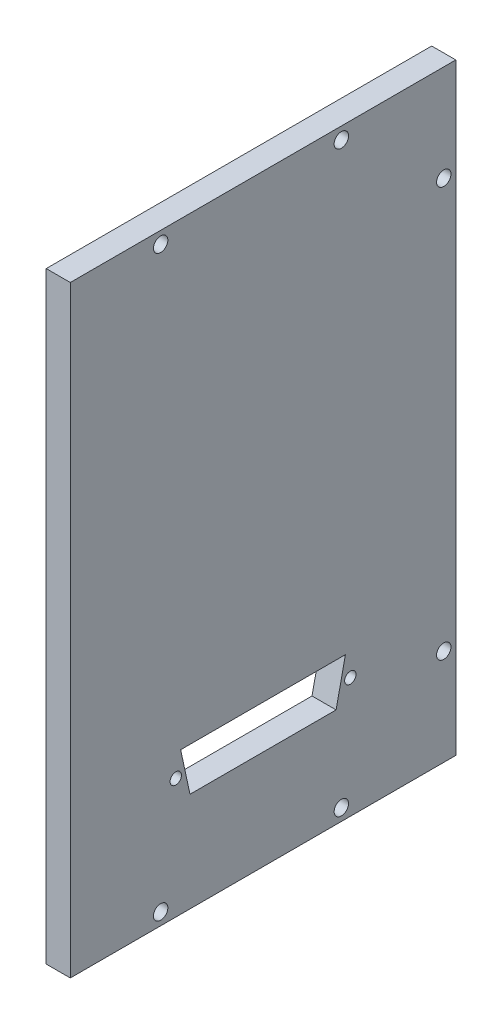
ISO-10303-21;
HEADER;
FILE_DESCRIPTION(('STEP AP214'),'2;1');
FILE_NAME('part.step','',(''),(''),'','','');
FILE_SCHEMA(('AUTOMOTIVE_DESIGN { 1 0 10303 214 1 1 1 1 }'));
ENDSEC;
DATA;
#1=APPLICATION_CONTEXT('core data for automotive mechanical design processes');
#2=APPLICATION_PROTOCOL_DEFINITION('international standard','automotive_design',2000,#1);
#3=PRODUCT_CONTEXT('',#1,'mechanical');
#4=PRODUCT('Part','Part','',(#3));
#5=PRODUCT_RELATED_PRODUCT_CATEGORY('part','',(#4));
#6=PRODUCT_DEFINITION_FORMATION('','',#4);
#7=PRODUCT_DEFINITION_CONTEXT('part definition',#1,'design');
#8=PRODUCT_DEFINITION('design','',#6,#7);
#9=PRODUCT_DEFINITION_SHAPE('','',#8);
#10=(LENGTH_UNIT() NAMED_UNIT(*) SI_UNIT(.MILLI.,.METRE.));
#11=(NAMED_UNIT(*) PLANE_ANGLE_UNIT() SI_UNIT($,.RADIAN.));
#12=(NAMED_UNIT(*) SI_UNIT($,.STERADIAN.) SOLID_ANGLE_UNIT());
#13=UNCERTAINTY_MEASURE_WITH_UNIT(LENGTH_MEASURE(1.E-05),#10,'distance_accuracy_value','');
#14=(GEOMETRIC_REPRESENTATION_CONTEXT(3) GLOBAL_UNCERTAINTY_ASSIGNED_CONTEXT((#13)) GLOBAL_UNIT_ASSIGNED_CONTEXT((#10,
#11,#12)) REPRESENTATION_CONTEXT('',''));
#15=CARTESIAN_POINT('',(0.,0.,0.));
#16=DIRECTION('',(0.,0.,1.));
#17=DIRECTION('',(1.,0.,0.));
#18=AXIS2_PLACEMENT_3D('',#15,#16,#17);
#19=CARTESIAN_POINT('',(0.,0.,0.));
#20=DIRECTION('',(-1.,0.,0.));
#21=DIRECTION('',(0.,0.,1.));
#22=AXIS2_PLACEMENT_3D('',#19,#20,#21);
#23=PLANE('',#22);
#24=CARTESIAN_POINT('',(0.,76.2,26.9875));
#25=DIRECTION('',(1.,0.,0.));
#26=DIRECTION('',(0.,0.,-1.));
#27=AXIS2_PLACEMENT_3D('',#24,#25,#26);
#28=CIRCLE('',#27,1.89864999999999);
#29=CARTESIAN_POINT('',(0.,76.2,25.08885));
#30=VERTEX_POINT('',#29);
#31=EDGE_CURVE('E299',#30,#30,#28,.T.);
#32=ORIENTED_EDGE('',*,*,#31,.T.);
#33=EDGE_LOOP('',(#32));
#34=FACE_BOUND('',#33,.T.);
#35=DIRECTION('',(0.,1.,0.));
#36=VECTOR('',#35,1.);
#37=CARTESIAN_POINT('',(0.,-79.375,-50.8));
#38=LINE('',#37,#36);
#39=CARTESIAN_POINT('',(0.,-79.375,-50.8));
#40=VERTEX_POINT('',#39);
#41=CARTESIAN_POINT('',(0.,79.375,-50.8));
#42=VERTEX_POINT('',#41);
#43=EDGE_CURVE('E142',#40,#42,#38,.T.);
#44=ORIENTED_EDGE('',*,*,#43,.F.);
#45=DIRECTION('',(0.,0.,-1.));
#46=VECTOR('',#45,1.);
#47=CARTESIAN_POINT('',(0.,-79.375,50.8));
#48=LINE('',#47,#46);
#49=CARTESIAN_POINT('',(0.,-79.375,50.8));
#50=VERTEX_POINT('',#49);
#51=EDGE_CURVE('E155',#50,#40,#48,.T.);
#52=ORIENTED_EDGE('',*,*,#51,.F.);
#53=DIRECTION('',(0.,-1.,0.));
#54=VECTOR('',#53,1.);
#55=CARTESIAN_POINT('',(0.,-79.375,50.8));
#56=LINE('',#55,#54);
#57=CARTESIAN_POINT('',(0.,79.375,50.8));
#58=VERTEX_POINT('',#57);
#59=EDGE_CURVE('E166',#58,#50,#56,.T.);
#60=ORIENTED_EDGE('',*,*,#59,.F.);
#61=DIRECTION('',(0.,0.,1.));
#62=VECTOR('',#61,1.);
#63=CARTESIAN_POINT('',(0.,79.375,50.8));
#64=LINE('',#63,#62);
#65=EDGE_CURVE('E164',#42,#58,#64,.T.);
#66=ORIENTED_EDGE('',*,*,#65,.F.);
#67=EDGE_LOOP('',(#44,#52,#60,#66));
#68=FACE_BOUND('',#67,.T.);
#69=CARTESIAN_POINT('',(0.,-47.725,23.));
#70=DIRECTION('',(1.,0.,0.));
#71=DIRECTION('',(0.,0.,-1.));
#72=AXIS2_PLACEMENT_3D('',#69,#70,#71);
#73=CIRCLE('',#72,1.5);
#74=CARTESIAN_POINT('',(0.,-47.725,21.5));
#75=VERTEX_POINT('',#74);
#76=EDGE_CURVE('E146',#75,#75,#73,.T.);
#77=ORIENTED_EDGE('',*,*,#76,.T.);
#78=EDGE_LOOP('',(#77));
#79=FACE_BOUND('',#78,.T.);
#80=CARTESIAN_POINT('',(0.,-47.725,-23.));
#81=DIRECTION('',(1.,0.,0.));
#82=DIRECTION('',(0.,0.,-1.));
#83=AXIS2_PLACEMENT_3D('',#80,#81,#82);
#84=CIRCLE('',#83,1.5);
#85=CARTESIAN_POINT('',(0.,-47.725,-24.5));
#86=VERTEX_POINT('',#85);
#87=EDGE_CURVE('E139',#86,#86,#84,.T.);
#88=ORIENTED_EDGE('',*,*,#87,.T.);
#89=EDGE_LOOP('',(#88));
#90=FACE_BOUND('',#89,.T.);
#91=DIRECTION('',(0.,0.977555086873891,-0.210679975619373));
#92=VECTOR('',#91,1.);
#93=CARTESIAN_POINT('',(0.,-53.2080700243806,-19.2557939166019));
#94=LINE('',#93,#92);
#95=CARTESIAN_POINT('',(0.,-53.2080700243806,-19.2557939166019));
#96=VERTEX_POINT('',#95);
#97=CARTESIAN_POINT('',(0.,-41.8205700243806,-21.7099965028088));
#98=VERTEX_POINT('',#97);
#99=EDGE_CURVE('E102',#96,#98,#94,.T.);
#100=ORIENTED_EDGE('',*,*,#99,.T.);
#101=DIRECTION('',(0.,0.,1.));
#102=VECTOR('',#101,1.);
#103=CARTESIAN_POINT('',(0.,-41.8205700243806,-21.7099965028088));
#104=LINE('',#103,#102);
#105=CARTESIAN_POINT('',(0.,-41.8205700243806,21.7099965028088));
#106=VERTEX_POINT('',#105);
#107=EDGE_CURVE('E111',#98,#106,#104,.T.);
#108=ORIENTED_EDGE('',*,*,#107,.T.);
#109=DIRECTION('',(0.,-0.977555086873891,-0.210679975619373));
#110=VECTOR('',#109,1.);
#111=CARTESIAN_POINT('',(0.,-41.8205700243806,21.7099965028088));
#112=LINE('',#111,#110);
#113=CARTESIAN_POINT('',(0.,-53.2080700243806,19.2557939166019));
#114=VERTEX_POINT('',#113);
#115=EDGE_CURVE('E58',#106,#114,#112,.T.);
#116=ORIENTED_EDGE('',*,*,#115,.T.);
#117=DIRECTION('',(0.,0.,-1.));
#118=VECTOR('',#117,1.);
#119=CARTESIAN_POINT('',(0.,-53.2080700243806,19.2557939166019));
#120=LINE('',#119,#118);
#121=EDGE_CURVE('E108',#114,#96,#120,.T.);
#122=ORIENTED_EDGE('',*,*,#121,.T.);
#123=EDGE_LOOP('',(#100,#108,#116,#122));
#124=FACE_BOUND('',#123,.T.);
#125=CARTESIAN_POINT('',(0.,-53.975,-47.625));
#126=DIRECTION('',(1.,0.,0.));
#127=DIRECTION('',(0.,0.,-1.));
#128=AXIS2_PLACEMENT_3D('',#125,#126,#127);
#129=CIRCLE('',#128,1.89864999999999);
#130=CARTESIAN_POINT('',(0.,-53.975,-49.52365));
#131=VERTEX_POINT('',#130);
#132=EDGE_CURVE('E123',#131,#131,#129,.T.);
#133=ORIENTED_EDGE('',*,*,#132,.T.);
#134=EDGE_LOOP('',(#133));
#135=FACE_BOUND('',#134,.T.);
#136=CARTESIAN_POINT('',(0.,53.975,-47.625));
#137=DIRECTION('',(1.,0.,0.));
#138=DIRECTION('',(0.,0.,-1.));
#139=AXIS2_PLACEMENT_3D('',#136,#137,#138);
#140=CIRCLE('',#139,1.89864999999999);
#141=CARTESIAN_POINT('',(0.,53.975,-49.52365));
#142=VERTEX_POINT('',#141);
#143=EDGE_CURVE('E316',#142,#142,#140,.T.);
#144=ORIENTED_EDGE('',*,*,#143,.T.);
#145=EDGE_LOOP('',(#144));
#146=FACE_BOUND('',#145,.T.);
#147=CARTESIAN_POINT('',(0.,-76.2,-20.6375));
#148=DIRECTION('',(1.,0.,0.));
#149=DIRECTION('',(0.,0.,-1.));
#150=AXIS2_PLACEMENT_3D('',#147,#148,#149);
#151=CIRCLE('',#150,1.89864999999999);
#152=CARTESIAN_POINT('',(0.,-76.2,-22.53615));
#153=VERTEX_POINT('',#152);
#154=EDGE_CURVE('E312',#153,#153,#151,.T.);
#155=ORIENTED_EDGE('',*,*,#154,.T.);
#156=EDGE_LOOP('',(#155));
#157=FACE_BOUND('',#156,.T.);
#158=CARTESIAN_POINT('',(0.,-76.2,26.9875));
#159=DIRECTION('',(1.,0.,0.));
#160=DIRECTION('',(0.,0.,-1.));
#161=AXIS2_PLACEMENT_3D('',#158,#159,#160);
#162=CIRCLE('',#161,1.89864999999999);
#163=CARTESIAN_POINT('',(0.,-76.2,25.08885));
#164=VERTEX_POINT('',#163);
#165=EDGE_CURVE('E308',#164,#164,#162,.T.);
#166=ORIENTED_EDGE('',*,*,#165,.T.);
#167=EDGE_LOOP('',(#166));
#168=FACE_BOUND('',#167,.T.);
#169=CARTESIAN_POINT('',(0.,76.2,-20.6375));
#170=DIRECTION('',(1.,0.,0.));
#171=DIRECTION('',(0.,0.,-1.));
#172=AXIS2_PLACEMENT_3D('',#169,#170,#171);
#173=CIRCLE('',#172,1.89864999999999);
#174=CARTESIAN_POINT('',(0.,76.2,-22.53615));
#175=VERTEX_POINT('',#174);
#176=EDGE_CURVE('E304',#175,#175,#173,.T.);
#177=ORIENTED_EDGE('',*,*,#176,.T.);
#178=EDGE_LOOP('',(#177));
#179=FACE_BOUND('',#178,.T.);
#180=ADVANCED_FACE('F35',(#34,#68,#79,#90,#124,#135,#146,#157,#168,#179),#23,.T.);
#181=CARTESIAN_POINT('',(6.35,-79.375,-50.8));
#182=DIRECTION('',(0.,0.,1.));
#183=DIRECTION('',(1.,0.,0.));
#184=AXIS2_PLACEMENT_3D('',#181,#182,#183);
#185=PLANE('',#184);
#186=ORIENTED_EDGE('',*,*,#43,.T.);
#187=DIRECTION('',(-1.,0.,0.));
#188=VECTOR('',#187,1.);
#189=CARTESIAN_POINT('',(6.35,79.375,-50.8));
#190=LINE('',#189,#188);
#191=CARTESIAN_POINT('',(6.35,79.375,-50.8));
#192=VERTEX_POINT('',#191);
#193=EDGE_CURVE('E11',#192,#42,#190,.T.);
#194=ORIENTED_EDGE('',*,*,#193,.F.);
#195=DIRECTION('',(0.,1.,0.));
#196=VECTOR('',#195,1.);
#197=CARTESIAN_POINT('',(6.35,-79.375,-50.8));
#198=LINE('',#197,#196);
#199=CARTESIAN_POINT('',(6.35,-79.375,-50.8));
#200=VERTEX_POINT('',#199);
#201=EDGE_CURVE('E151',#200,#192,#198,.T.);
#202=ORIENTED_EDGE('',*,*,#201,.F.);
#203=DIRECTION('',(-1.,0.,0.));
#204=VECTOR('',#203,1.);
#205=CARTESIAN_POINT('',(6.35,-79.375,-50.8));
#206=LINE('',#205,#204);
#207=EDGE_CURVE('E161',#200,#40,#206,.T.);
#208=ORIENTED_EDGE('',*,*,#207,.T.);
#209=EDGE_LOOP('',(#186,#194,#202,#208));
#210=FACE_BOUND('',#209,.T.);
#211=ADVANCED_FACE('F37',(#210),#185,.F.);
#212=CARTESIAN_POINT('',(6.35,79.375,50.8));
#213=DIRECTION('',(0.,-1.,0.));
#214=DIRECTION('',(0.,0.,-1.));
#215=AXIS2_PLACEMENT_3D('',#212,#213,#214);
#216=PLANE('',#215);
#217=ORIENTED_EDGE('',*,*,#65,.T.);
#218=DIRECTION('',(-1.,0.,0.));
#219=VECTOR('',#218,1.);
#220=CARTESIAN_POINT('',(6.35,79.375,50.8));
#221=LINE('',#220,#219);
#222=CARTESIAN_POINT('',(6.35,79.375,50.8));
#223=VERTEX_POINT('',#222);
#224=EDGE_CURVE('E43',#223,#58,#221,.T.);
#225=ORIENTED_EDGE('',*,*,#224,.F.);
#226=DIRECTION('',(0.,0.,1.));
#227=VECTOR('',#226,1.);
#228=CARTESIAN_POINT('',(6.35,79.375,50.8));
#229=LINE('',#228,#227);
#230=EDGE_CURVE('E154',#192,#223,#229,.T.);
#231=ORIENTED_EDGE('',*,*,#230,.F.);
#232=ORIENTED_EDGE('',*,*,#193,.T.);
#233=EDGE_LOOP('',(#217,#225,#231,#232));
#234=FACE_BOUND('',#233,.T.);
#235=ADVANCED_FACE('F194',(#234),#216,.F.);
#236=CARTESIAN_POINT('',(6.35,-79.375,50.8));
#237=DIRECTION('',(0.,0.,-1.));
#238=DIRECTION('',(-1.,0.,0.));
#239=AXIS2_PLACEMENT_3D('',#236,#237,#238);
#240=PLANE('',#239);
#241=ORIENTED_EDGE('',*,*,#59,.T.);
#242=DIRECTION('',(-1.,0.,0.));
#243=VECTOR('',#242,1.);
#244=CARTESIAN_POINT('',(6.35,-79.375,50.8));
#245=LINE('',#244,#243);
#246=CARTESIAN_POINT('',(6.35,-79.375,50.8));
#247=VERTEX_POINT('',#246);
#248=EDGE_CURVE('E171',#247,#50,#245,.T.);
#249=ORIENTED_EDGE('',*,*,#248,.F.);
#250=DIRECTION('',(0.,-1.,0.));
#251=VECTOR('',#250,1.);
#252=CARTESIAN_POINT('',(6.35,-79.375,50.8));
#253=LINE('',#252,#251);
#254=EDGE_CURVE('E157',#223,#247,#253,.T.);
#255=ORIENTED_EDGE('',*,*,#254,.F.);
#256=ORIENTED_EDGE('',*,*,#224,.T.);
#257=EDGE_LOOP('',(#241,#249,#255,#256));
#258=FACE_BOUND('',#257,.T.);
#259=ADVANCED_FACE('F178',(#258),#240,.F.);
#260=CARTESIAN_POINT('',(6.35,-79.375,50.8));
#261=DIRECTION('',(0.,1.,0.));
#262=DIRECTION('',(0.,0.,1.));
#263=AXIS2_PLACEMENT_3D('',#260,#261,#262);
#264=PLANE('',#263);
#265=ORIENTED_EDGE('',*,*,#51,.T.);
#266=ORIENTED_EDGE('',*,*,#207,.F.);
#267=DIRECTION('',(0.,0.,-1.));
#268=VECTOR('',#267,1.);
#269=CARTESIAN_POINT('',(6.35,-79.375,50.8));
#270=LINE('',#269,#268);
#271=EDGE_CURVE('E159',#247,#200,#270,.T.);
#272=ORIENTED_EDGE('',*,*,#271,.F.);
#273=ORIENTED_EDGE('',*,*,#248,.T.);
#274=EDGE_LOOP('',(#265,#266,#272,#273));
#275=FACE_BOUND('',#274,.T.);
#276=ADVANCED_FACE('F187',(#275),#264,.F.);
#277=CARTESIAN_POINT('',(6.35,0.,0.));
#278=DIRECTION('',(-1.,0.,0.));
#279=DIRECTION('',(0.,0.,1.));
#280=AXIS2_PLACEMENT_3D('',#277,#278,#279);
#281=PLANE('',#280);
#282=CARTESIAN_POINT('',(6.35,76.2,26.9875));
#283=DIRECTION('',(1.,0.,0.));
#284=DIRECTION('',(0.,0.,-1.));
#285=AXIS2_PLACEMENT_3D('',#282,#283,#284);
#286=CIRCLE('',#285,1.89864999999999);
#287=CARTESIAN_POINT('',(6.35,76.2,25.08885));
#288=VERTEX_POINT('',#287);
#289=EDGE_CURVE('E226',#288,#288,#286,.T.);
#290=ORIENTED_EDGE('',*,*,#289,.F.);
#291=EDGE_LOOP('',(#290));
#292=FACE_BOUND('',#291,.T.);
#293=CARTESIAN_POINT('',(6.35,76.2,-20.6375));
#294=DIRECTION('',(1.,0.,0.));
#295=DIRECTION('',(0.,0.,-1.));
#296=AXIS2_PLACEMENT_3D('',#293,#294,#295);
#297=CIRCLE('',#296,1.89864999999999);
#298=CARTESIAN_POINT('',(6.35,76.2,-22.53615));
#299=VERTEX_POINT('',#298);
#300=EDGE_CURVE('E230',#299,#299,#297,.T.);
#301=ORIENTED_EDGE('',*,*,#300,.F.);
#302=EDGE_LOOP('',(#301));
#303=FACE_BOUND('',#302,.T.);
#304=CARTESIAN_POINT('',(6.35,-76.2,26.9875));
#305=DIRECTION('',(1.,0.,0.));
#306=DIRECTION('',(0.,0.,-1.));
#307=AXIS2_PLACEMENT_3D('',#304,#305,#306);
#308=CIRCLE('',#307,1.89864999999999);
#309=CARTESIAN_POINT('',(6.35,-76.2,25.08885));
#310=VERTEX_POINT('',#309);
#311=EDGE_CURVE('E234',#310,#310,#308,.T.);
#312=ORIENTED_EDGE('',*,*,#311,.F.);
#313=EDGE_LOOP('',(#312));
#314=FACE_BOUND('',#313,.T.);
#315=CARTESIAN_POINT('',(6.35,-76.2,-20.6375));
#316=DIRECTION('',(1.,0.,0.));
#317=DIRECTION('',(0.,0.,-1.));
#318=AXIS2_PLACEMENT_3D('',#315,#316,#317);
#319=CIRCLE('',#318,1.89864999999999);
#320=CARTESIAN_POINT('',(6.35,-76.2,-22.53615));
#321=VERTEX_POINT('',#320);
#322=EDGE_CURVE('E238',#321,#321,#319,.T.);
#323=ORIENTED_EDGE('',*,*,#322,.F.);
#324=EDGE_LOOP('',(#323));
#325=FACE_BOUND('',#324,.T.);
#326=CARTESIAN_POINT('',(6.35,53.975,-47.625));
#327=DIRECTION('',(1.,0.,0.));
#328=DIRECTION('',(0.,0.,-1.));
#329=AXIS2_PLACEMENT_3D('',#326,#327,#328);
#330=CIRCLE('',#329,1.89864999999999);
#331=CARTESIAN_POINT('',(6.35,53.975,-49.52365));
#332=VERTEX_POINT('',#331);
#333=EDGE_CURVE('E242',#332,#332,#330,.T.);
#334=ORIENTED_EDGE('',*,*,#333,.F.);
#335=EDGE_LOOP('',(#334));
#336=FACE_BOUND('',#335,.T.);
#337=CARTESIAN_POINT('',(6.35,-53.975,-47.625));
#338=DIRECTION('',(1.,0.,0.));
#339=DIRECTION('',(0.,0.,-1.));
#340=AXIS2_PLACEMENT_3D('',#337,#338,#339);
#341=CIRCLE('',#340,1.89864999999999);
#342=CARTESIAN_POINT('',(6.35,-53.975,-49.52365));
#343=VERTEX_POINT('',#342);
#344=EDGE_CURVE('E246',#343,#343,#341,.T.);
#345=ORIENTED_EDGE('',*,*,#344,.F.);
#346=EDGE_LOOP('',(#345));
#347=FACE_BOUND('',#346,.T.);
#348=DIRECTION('',(0.,0.,1.));
#349=VECTOR('',#348,1.);
#350=CARTESIAN_POINT('',(6.35,-41.8205700243806,-21.7099965028088));
#351=LINE('',#350,#349);
#352=CARTESIAN_POINT('',(6.35,-41.8205700243806,-21.7099965028088));
#353=VERTEX_POINT('',#352);
#354=CARTESIAN_POINT('',(6.35,-41.8205700243806,21.7099965028088));
#355=VERTEX_POINT('',#354);
#356=EDGE_CURVE('E129',#353,#355,#351,.T.);
#357=ORIENTED_EDGE('',*,*,#356,.F.);
#358=DIRECTION('',(0.,0.977555086873891,-0.210679975619373));
#359=VECTOR('',#358,1.);
#360=CARTESIAN_POINT('',(6.35,-53.2080700243806,-19.2557939166019));
#361=LINE('',#360,#359);
#362=CARTESIAN_POINT('',(6.35,-53.2080700243806,-19.2557939166019));
#363=VERTEX_POINT('',#362);
#364=EDGE_CURVE('E50',#363,#353,#361,.T.);
#365=ORIENTED_EDGE('',*,*,#364,.F.);
#366=DIRECTION('',(0.,0.,-1.));
#367=VECTOR('',#366,1.);
#368=CARTESIAN_POINT('',(6.35,-53.2080700243806,19.2557939166019));
#369=LINE('',#368,#367);
#370=CARTESIAN_POINT('',(6.35,-53.2080700243806,19.2557939166019));
#371=VERTEX_POINT('',#370);
#372=EDGE_CURVE('E117',#371,#363,#369,.T.);
#373=ORIENTED_EDGE('',*,*,#372,.F.);
#374=DIRECTION('',(0.,-0.977555086873891,-0.210679975619373));
#375=VECTOR('',#374,1.);
#376=CARTESIAN_POINT('',(6.35,-41.8205700243806,21.7099965028088));
#377=LINE('',#376,#375);
#378=EDGE_CURVE('E120',#355,#371,#377,.T.);
#379=ORIENTED_EDGE('',*,*,#378,.F.);
#380=EDGE_LOOP('',(#357,#365,#373,#379));
#381=FACE_BOUND('',#380,.T.);
#382=CARTESIAN_POINT('',(6.35,-47.725,-23.));
#383=DIRECTION('',(1.,0.,0.));
#384=DIRECTION('',(0.,0.,-1.));
#385=AXIS2_PLACEMENT_3D('',#382,#383,#384);
#386=CIRCLE('',#385,1.5);
#387=CARTESIAN_POINT('',(6.35,-47.725,-24.5));
#388=VERTEX_POINT('',#387);
#389=EDGE_CURVE('E143',#388,#388,#386,.T.);
#390=ORIENTED_EDGE('',*,*,#389,.F.);
#391=EDGE_LOOP('',(#390));
#392=FACE_BOUND('',#391,.T.);
#393=CARTESIAN_POINT('',(6.35,-47.725,23.));
#394=DIRECTION('',(1.,0.,0.));
#395=DIRECTION('',(0.,0.,-1.));
#396=AXIS2_PLACEMENT_3D('',#393,#394,#395);
#397=CIRCLE('',#396,1.5);
#398=CARTESIAN_POINT('',(6.35,-47.725,21.5));
#399=VERTEX_POINT('',#398);
#400=EDGE_CURVE('E135',#399,#399,#397,.T.);
#401=ORIENTED_EDGE('',*,*,#400,.F.);
#402=EDGE_LOOP('',(#401));
#403=FACE_BOUND('',#402,.T.);
#404=ORIENTED_EDGE('',*,*,#201,.T.);
#405=ORIENTED_EDGE('',*,*,#230,.T.);
#406=ORIENTED_EDGE('',*,*,#254,.T.);
#407=ORIENTED_EDGE('',*,*,#271,.T.);
#408=EDGE_LOOP('',(#404,#405,#406,#407));
#409=FACE_BOUND('',#408,.T.);
#410=ADVANCED_FACE('F193',(#292,#303,#314,#325,#336,#347,#381,#392,#403,#409),#281,.F.);
#411=CARTESIAN_POINT('',(0.,-47.725,23.));
#412=DIRECTION('',(1.,0.,0.));
#413=DIRECTION('',(0.,0.,-1.));
#414=AXIS2_PLACEMENT_3D('',#411,#412,#413);
#415=CYLINDRICAL_SURFACE('',#414,1.5);
#416=ORIENTED_EDGE('',*,*,#76,.F.);
#417=EDGE_LOOP('',(#416));
#418=FACE_BOUND('',#417,.T.);
#419=ORIENTED_EDGE('',*,*,#400,.T.);
#420=EDGE_LOOP('',(#419));
#421=FACE_BOUND('',#420,.T.);
#422=ADVANCED_FACE('F216',(#418,#421),#415,.F.);
#423=CARTESIAN_POINT('',(0.,-47.725,-23.));
#424=DIRECTION('',(1.,0.,0.));
#425=DIRECTION('',(0.,0.,-1.));
#426=AXIS2_PLACEMENT_3D('',#423,#424,#425);
#427=CYLINDRICAL_SURFACE('',#426,1.5);
#428=ORIENTED_EDGE('',*,*,#87,.F.);
#429=EDGE_LOOP('',(#428));
#430=FACE_BOUND('',#429,.T.);
#431=ORIENTED_EDGE('',*,*,#389,.T.);
#432=EDGE_LOOP('',(#431));
#433=FACE_BOUND('',#432,.T.);
#434=ADVANCED_FACE('F221',(#430,#433),#427,.F.);
#435=CARTESIAN_POINT('',(0.,-53.2080700243806,-19.2557939166019));
#436=DIRECTION('',(0.,-0.210679975619373,-0.977555086873891));
#437=DIRECTION('',(0.,0.977555086873891,-0.210679975619373));
#438=AXIS2_PLACEMENT_3D('',#435,#436,#437);
#439=PLANE('',#438);
#440=ORIENTED_EDGE('',*,*,#364,.T.);
#441=DIRECTION('',(1.,0.,0.));
#442=VECTOR('',#441,1.);
#443=CARTESIAN_POINT('',(0.,-41.8205700243806,-21.7099965028088));
#444=LINE('',#443,#442);
#445=EDGE_CURVE('E98',#98,#353,#444,.T.);
#446=ORIENTED_EDGE('',*,*,#445,.F.);
#447=ORIENTED_EDGE('',*,*,#99,.F.);
#448=DIRECTION('',(1.,0.,0.));
#449=VECTOR('',#448,1.);
#450=CARTESIAN_POINT('',(0.,-53.2080700243806,-19.2557939166019));
#451=LINE('',#450,#449);
#452=EDGE_CURVE('E133',#96,#363,#451,.T.);
#453=ORIENTED_EDGE('',*,*,#452,.T.);
#454=EDGE_LOOP('',(#440,#446,#447,#453));
#455=FACE_BOUND('',#454,.T.);
#456=ADVANCED_FACE('F100',(#455),#439,.F.);
#457=CARTESIAN_POINT('',(0.,-53.2080700243806,19.2557939166019));
#458=DIRECTION('',(0.,-1.,0.));
#459=DIRECTION('',(0.,0.,-1.));
#460=AXIS2_PLACEMENT_3D('',#457,#458,#459);
#461=PLANE('',#460);
#462=ORIENTED_EDGE('',*,*,#372,.T.);
#463=ORIENTED_EDGE('',*,*,#452,.F.);
#464=ORIENTED_EDGE('',*,*,#121,.F.);
#465=DIRECTION('',(1.,0.,0.));
#466=VECTOR('',#465,1.);
#467=CARTESIAN_POINT('',(0.,-53.2080700243806,19.2557939166019));
#468=LINE('',#467,#466);
#469=EDGE_CURVE('E136',#114,#371,#468,.T.);
#470=ORIENTED_EDGE('',*,*,#469,.T.);
#471=EDGE_LOOP('',(#462,#463,#464,#470));
#472=FACE_BOUND('',#471,.T.);
#473=ADVANCED_FACE('F260',(#472),#461,.F.);
#474=CARTESIAN_POINT('',(0.,-41.8205700243806,21.7099965028088));
#475=DIRECTION('',(0.,-0.210679975619373,0.977555086873891));
#476=DIRECTION('',(0.,-0.977555086873891,-0.210679975619373));
#477=AXIS2_PLACEMENT_3D('',#474,#475,#476);
#478=PLANE('',#477);
#479=ORIENTED_EDGE('',*,*,#378,.T.);
#480=ORIENTED_EDGE('',*,*,#469,.F.);
#481=ORIENTED_EDGE('',*,*,#115,.F.);
#482=DIRECTION('',(1.,0.,0.));
#483=VECTOR('',#482,1.);
#484=CARTESIAN_POINT('',(0.,-41.8205700243806,21.7099965028088));
#485=LINE('',#484,#483);
#486=EDGE_CURVE('E107',#106,#355,#485,.T.);
#487=ORIENTED_EDGE('',*,*,#486,.T.);
#488=EDGE_LOOP('',(#479,#480,#481,#487));
#489=FACE_BOUND('',#488,.T.);
#490=ADVANCED_FACE('F267',(#489),#478,.F.);
#491=CARTESIAN_POINT('',(0.,-41.8205700243806,-21.7099965028088));
#492=DIRECTION('',(0.,1.,0.));
#493=DIRECTION('',(0.,0.,1.));
#494=AXIS2_PLACEMENT_3D('',#491,#492,#493);
#495=PLANE('',#494);
#496=ORIENTED_EDGE('',*,*,#356,.T.);
#497=ORIENTED_EDGE('',*,*,#486,.F.);
#498=ORIENTED_EDGE('',*,*,#107,.F.);
#499=ORIENTED_EDGE('',*,*,#445,.T.);
#500=EDGE_LOOP('',(#496,#497,#498,#499));
#501=FACE_BOUND('',#500,.T.);
#502=ADVANCED_FACE('F112',(#501),#495,.F.);
#503=CARTESIAN_POINT('',(6.35,-53.975,-47.625));
#504=DIRECTION('',(1.,0.,0.));
#505=DIRECTION('',(0.,0.,-1.));
#506=AXIS2_PLACEMENT_3D('',#503,#504,#505);
#507=CYLINDRICAL_SURFACE('',#506,1.89864999999999);
#508=ORIENTED_EDGE('',*,*,#132,.F.);
#509=EDGE_LOOP('',(#508));
#510=FACE_BOUND('',#509,.T.);
#511=ORIENTED_EDGE('',*,*,#344,.T.);
#512=EDGE_LOOP('',(#511));
#513=FACE_BOUND('',#512,.T.);
#514=ADVANCED_FACE('F266',(#510,#513),#507,.F.);
#515=CARTESIAN_POINT('',(6.35,53.975,-47.625));
#516=DIRECTION('',(1.,0.,0.));
#517=DIRECTION('',(0.,0.,-1.));
#518=AXIS2_PLACEMENT_3D('',#515,#516,#517);
#519=CYLINDRICAL_SURFACE('',#518,1.89864999999999);
#520=ORIENTED_EDGE('',*,*,#143,.F.);
#521=EDGE_LOOP('',(#520));
#522=FACE_BOUND('',#521,.T.);
#523=ORIENTED_EDGE('',*,*,#333,.T.);
#524=EDGE_LOOP('',(#523));
#525=FACE_BOUND('',#524,.T.);
#526=ADVANCED_FACE('F275',(#522,#525),#519,.F.);
#527=CARTESIAN_POINT('',(6.35,-76.2,-20.6375));
#528=DIRECTION('',(1.,0.,0.));
#529=DIRECTION('',(0.,0.,-1.));
#530=AXIS2_PLACEMENT_3D('',#527,#528,#529);
#531=CYLINDRICAL_SURFACE('',#530,1.89864999999999);
#532=ORIENTED_EDGE('',*,*,#154,.F.);
#533=EDGE_LOOP('',(#532));
#534=FACE_BOUND('',#533,.T.);
#535=ORIENTED_EDGE('',*,*,#322,.T.);
#536=EDGE_LOOP('',(#535));
#537=FACE_BOUND('',#536,.T.);
#538=ADVANCED_FACE('F279',(#534,#537),#531,.F.);
#539=CARTESIAN_POINT('',(6.35,-76.2,26.9875));
#540=DIRECTION('',(1.,0.,0.));
#541=DIRECTION('',(0.,0.,-1.));
#542=AXIS2_PLACEMENT_3D('',#539,#540,#541);
#543=CYLINDRICAL_SURFACE('',#542,1.89864999999999);
#544=ORIENTED_EDGE('',*,*,#165,.F.);
#545=EDGE_LOOP('',(#544));
#546=FACE_BOUND('',#545,.T.);
#547=ORIENTED_EDGE('',*,*,#311,.T.);
#548=EDGE_LOOP('',(#547));
#549=FACE_BOUND('',#548,.T.);
#550=ADVANCED_FACE('F283',(#546,#549),#543,.F.);
#551=CARTESIAN_POINT('',(6.35,76.2,-20.6375));
#552=DIRECTION('',(1.,0.,0.));
#553=DIRECTION('',(0.,0.,-1.));
#554=AXIS2_PLACEMENT_3D('',#551,#552,#553);
#555=CYLINDRICAL_SURFACE('',#554,1.89864999999999);
#556=ORIENTED_EDGE('',*,*,#176,.F.);
#557=EDGE_LOOP('',(#556));
#558=FACE_BOUND('',#557,.T.);
#559=ORIENTED_EDGE('',*,*,#300,.T.);
#560=EDGE_LOOP('',(#559));
#561=FACE_BOUND('',#560,.T.);
#562=ADVANCED_FACE('F287',(#558,#561),#555,.F.);
#563=CARTESIAN_POINT('',(6.35,76.2,26.9875));
#564=DIRECTION('',(1.,0.,0.));
#565=DIRECTION('',(0.,0.,-1.));
#566=AXIS2_PLACEMENT_3D('',#563,#564,#565);
#567=CYLINDRICAL_SURFACE('',#566,1.89864999999999);
#568=ORIENTED_EDGE('',*,*,#31,.F.);
#569=EDGE_LOOP('',(#568));
#570=FACE_BOUND('',#569,.T.);
#571=ORIENTED_EDGE('',*,*,#289,.T.);
#572=EDGE_LOOP('',(#571));
#573=FACE_BOUND('',#572,.T.);
#574=ADVANCED_FACE('F291',(#570,#573),#567,.F.);
#575=CLOSED_SHELL('',(#180,#211,#235,#259,#276,#410,#422,#434,#456,#473,#490,#502,#514,#526,
#538,#550,#562,#574));
#576=MANIFOLD_SOLID_BREP('B2',#575);
#577=ADVANCED_BREP_SHAPE_REPRESENTATION('',(#18,#576),#14);
#578=SHAPE_DEFINITION_REPRESENTATION(#9,#577);
ENDSEC;
END-ISO-10303-21;
